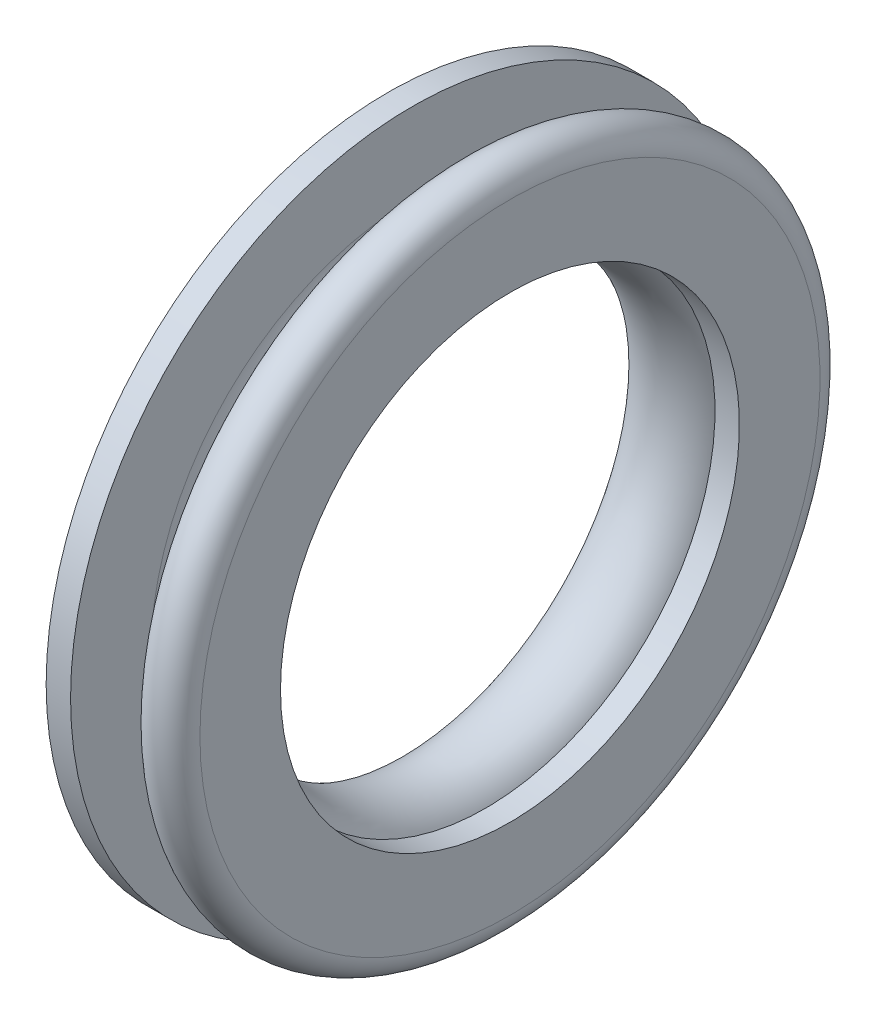
ISO-10303-21;
HEADER;
FILE_DESCRIPTION(('STEP AP214'),'2;1');
FILE_NAME('part.step','',(''),(''),'','','');
FILE_SCHEMA(('AUTOMOTIVE_DESIGN { 1 0 10303 214 1 1 1 1 }'));
ENDSEC;
DATA;
#1=APPLICATION_CONTEXT('core data for automotive mechanical design processes');
#2=APPLICATION_PROTOCOL_DEFINITION('international standard','automotive_design',2000,#1);
#3=PRODUCT_CONTEXT('',#1,'mechanical');
#4=PRODUCT('Part','Part','',(#3));
#5=PRODUCT_RELATED_PRODUCT_CATEGORY('part','',(#4));
#6=PRODUCT_DEFINITION_FORMATION('','',#4);
#7=PRODUCT_DEFINITION_CONTEXT('part definition',#1,'design');
#8=PRODUCT_DEFINITION('design','',#6,#7);
#9=PRODUCT_DEFINITION_SHAPE('','',#8);
#10=(LENGTH_UNIT() NAMED_UNIT(*) SI_UNIT(.MILLI.,.METRE.));
#11=(NAMED_UNIT(*) PLANE_ANGLE_UNIT() SI_UNIT($,.RADIAN.));
#12=(NAMED_UNIT(*) SI_UNIT($,.STERADIAN.) SOLID_ANGLE_UNIT());
#13=UNCERTAINTY_MEASURE_WITH_UNIT(LENGTH_MEASURE(1.E-05),#10,'distance_accuracy_value','');
#14=(GEOMETRIC_REPRESENTATION_CONTEXT(3) GLOBAL_UNCERTAINTY_ASSIGNED_CONTEXT((#13)) GLOBAL_UNIT_ASSIGNED_CONTEXT((#10,
#11,#12)) REPRESENTATION_CONTEXT('',''));
#15=CARTESIAN_POINT('',(0.,0.,0.));
#16=DIRECTION('',(0.,0.,1.));
#17=DIRECTION('',(1.,0.,0.));
#18=AXIS2_PLACEMENT_3D('',#15,#16,#17);
#19=CARTESIAN_POINT('',(1.,-5.35,0.));
#20=DIRECTION('',(-1.,0.,0.));
#21=DIRECTION('',(0.,0.,1.));
#22=AXIS2_PLACEMENT_3D('',#19,#20,#21);
#23=TOROIDAL_SURFACE('',#22,5.35,1.);
#24=CARTESIAN_POINT('',(2.,-5.35,0.));
#25=DIRECTION('',(-1.,0.,0.));
#26=DIRECTION('',(0.,0.,1.));
#27=AXIS2_PLACEMENT_3D('',#24,#25,#26);
#28=CIRCLE('',#27,5.35);
#29=CARTESIAN_POINT('',(2.,-5.35,5.35));
#30=VERTEX_POINT('',#29);
#31=EDGE_CURVE('E10',#30,#30,#28,.T.);
#32=ORIENTED_EDGE('',*,*,#31,.F.);
#33=EDGE_LOOP('',(#32));
#34=FACE_BOUND('',#33,.T.);
#35=CARTESIAN_POINT('',(0.,-5.35,0.));
#36=DIRECTION('',(-1.,0.,0.));
#37=DIRECTION('',(0.,0.,1.));
#38=AXIS2_PLACEMENT_3D('',#35,#36,#37);
#39=CIRCLE('',#38,5.35);
#40=CARTESIAN_POINT('',(0.,-5.35,5.35));
#41=VERTEX_POINT('',#40);
#42=EDGE_CURVE('E67',#41,#41,#39,.T.);
#43=ORIENTED_EDGE('',*,*,#42,.T.);
#44=EDGE_LOOP('',(#43));
#45=FACE_BOUND('',#44,.T.);
#46=ADVANCED_FACE('F33',(#34,#45),#23,.T.);
#47=CARTESIAN_POINT('',(2.,0.,0.));
#48=DIRECTION('',(1.,0.,0.));
#49=DIRECTION('',(0.,0.,-1.));
#50=AXIS2_PLACEMENT_3D('',#47,#48,#49);
#51=PLANE('',#50);
#52=CARTESIAN_POINT('',(2.,-5.35,0.));
#53=DIRECTION('',(-1.,0.,0.));
#54=DIRECTION('',(0.,0.,1.));
#55=AXIS2_PLACEMENT_3D('',#52,#53,#54);
#56=CIRCLE('',#55,4.7);
#57=CARTESIAN_POINT('',(2.,-5.35,4.7));
#58=VERTEX_POINT('',#57);
#59=EDGE_CURVE('E39',#58,#58,#56,.T.);
#60=ORIENTED_EDGE('',*,*,#59,.F.);
#61=EDGE_LOOP('',(#60));
#62=FACE_BOUND('',#61,.T.);
#63=ORIENTED_EDGE('',*,*,#31,.T.);
#64=EDGE_LOOP('',(#63));
#65=FACE_BOUND('',#64,.T.);
#66=ADVANCED_FACE('F96',(#62,#65),#51,.F.);
#67=CARTESIAN_POINT('',(0.,-5.35,0.));
#68=DIRECTION('',(-1.,0.,0.));
#69=DIRECTION('',(0.,0.,1.));
#70=AXIS2_PLACEMENT_3D('',#67,#68,#69);
#71=CYLINDRICAL_SURFACE('',#70,4.7);
#72=ORIENTED_EDGE('',*,*,#59,.T.);
#73=EDGE_LOOP('',(#72));
#74=FACE_BOUND('',#73,.T.);
#75=CARTESIAN_POINT('',(2.5,-5.35,0.));
#76=DIRECTION('',(-1.,0.,0.));
#77=DIRECTION('',(0.,0.,1.));
#78=AXIS2_PLACEMENT_3D('',#75,#76,#77);
#79=CIRCLE('',#78,4.7);
#80=CARTESIAN_POINT('',(2.5,-5.35,4.7));
#81=VERTEX_POINT('',#80);
#82=EDGE_CURVE('E43',#81,#81,#79,.T.);
#83=ORIENTED_EDGE('',*,*,#82,.F.);
#84=EDGE_LOOP('',(#83));
#85=FACE_BOUND('',#84,.T.);
#86=ADVANCED_FACE('F101',(#74,#85),#71,.F.);
#87=CARTESIAN_POINT('',(2.5,0.,0.));
#88=DIRECTION('',(1.,0.,0.));
#89=DIRECTION('',(0.,0.,-1.));
#90=AXIS2_PLACEMENT_3D('',#87,#88,#89);
#91=PLANE('',#90);
#92=ORIENTED_EDGE('',*,*,#82,.T.);
#93=EDGE_LOOP('',(#92));
#94=FACE_BOUND('',#93,.T.);
#95=CARTESIAN_POINT('',(2.5,-5.35,0.));
#96=DIRECTION('',(-1.,0.,0.));
#97=DIRECTION('',(0.,0.,1.));
#98=AXIS2_PLACEMENT_3D('',#95,#96,#97);
#99=CIRCLE('',#98,6.35);
#100=CARTESIAN_POINT('',(2.5,-5.35,6.35));
#101=VERTEX_POINT('',#100);
#102=EDGE_CURVE('E47',#101,#101,#99,.T.);
#103=ORIENTED_EDGE('',*,*,#102,.F.);
#104=EDGE_LOOP('',(#103));
#105=FACE_BOUND('',#104,.T.);
#106=ADVANCED_FACE('F106',(#94,#105),#91,.T.);
#107=CARTESIAN_POINT('',(2.,-5.35,0.));
#108=DIRECTION('',(-1.,0.,0.));
#109=DIRECTION('',(0.,0.,1.));
#110=AXIS2_PLACEMENT_3D('',#107,#108,#109);
#111=TOROIDAL_SURFACE('',#110,6.35,0.5);
#112=ORIENTED_EDGE('',*,*,#102,.T.);
#113=EDGE_LOOP('',(#112));
#114=FACE_BOUND('',#113,.T.);
#115=CARTESIAN_POINT('',(1.5,-5.35,0.));
#116=DIRECTION('',(-1.,0.,0.));
#117=DIRECTION('',(0.,0.,1.));
#118=AXIS2_PLACEMENT_3D('',#115,#116,#117);
#119=CIRCLE('',#118,6.35);
#120=CARTESIAN_POINT('',(1.5,-5.35,6.35));
#121=VERTEX_POINT('',#120);
#122=EDGE_CURVE('E52',#121,#121,#119,.T.);
#123=ORIENTED_EDGE('',*,*,#122,.F.);
#124=EDGE_LOOP('',(#123));
#125=FACE_BOUND('',#124,.T.);
#126=ADVANCED_FACE('F111',(#114,#125),#111,.T.);
#127=CARTESIAN_POINT('',(1.5,0.,0.));
#128=DIRECTION('',(-1.,0.,0.));
#129=DIRECTION('',(0.,0.,1.));
#130=AXIS2_PLACEMENT_3D('',#127,#128,#129);
#131=PLANE('',#130);
#132=ORIENTED_EDGE('',*,*,#122,.T.);
#133=EDGE_LOOP('',(#132));
#134=FACE_BOUND('',#133,.T.);
#135=CARTESIAN_POINT('',(1.5,-5.35,0.));
#136=DIRECTION('',(-1.,0.,0.));
#137=DIRECTION('',(0.,0.,1.));
#138=AXIS2_PLACEMENT_3D('',#135,#136,#137);
#139=CIRCLE('',#138,5.35);
#140=CARTESIAN_POINT('',(1.5,-5.35,5.35));
#141=VERTEX_POINT('',#140);
#142=EDGE_CURVE('E55',#141,#141,#139,.T.);
#143=ORIENTED_EDGE('',*,*,#142,.F.);
#144=EDGE_LOOP('',(#143));
#145=FACE_BOUND('',#144,.T.);
#146=ADVANCED_FACE('F92',(#134,#145),#131,.T.);
#147=CARTESIAN_POINT('',(1.,-5.35,0.));
#148=DIRECTION('',(-1.,0.,0.));
#149=DIRECTION('',(0.,0.,1.));
#150=AXIS2_PLACEMENT_3D('',#147,#148,#149);
#151=TOROIDAL_SURFACE('',#150,5.35,0.5);
#152=ORIENTED_EDGE('',*,*,#142,.T.);
#153=EDGE_LOOP('',(#152));
#154=FACE_BOUND('',#153,.T.);
#155=CARTESIAN_POINT('',(0.5,-5.35,0.));
#156=DIRECTION('',(-1.,0.,0.));
#157=DIRECTION('',(0.,0.,1.));
#158=AXIS2_PLACEMENT_3D('',#155,#156,#157);
#159=CIRCLE('',#158,5.35);
#160=CARTESIAN_POINT('',(0.5,-5.35,5.35));
#161=VERTEX_POINT('',#160);
#162=EDGE_CURVE('E58',#161,#161,#159,.T.);
#163=ORIENTED_EDGE('',*,*,#162,.F.);
#164=EDGE_LOOP('',(#163));
#165=FACE_BOUND('',#164,.T.);
#166=ADVANCED_FACE('F86',(#154,#165),#151,.F.);
#167=CARTESIAN_POINT('',(0.5,0.,0.));
#168=DIRECTION('',(1.,0.,0.));
#169=DIRECTION('',(0.,0.,-1.));
#170=AXIS2_PLACEMENT_3D('',#167,#168,#169);
#171=PLANE('',#170);
#172=ORIENTED_EDGE('',*,*,#162,.T.);
#173=EDGE_LOOP('',(#172));
#174=FACE_BOUND('',#173,.T.);
#175=CARTESIAN_POINT('',(0.5,-5.35,0.));
#176=DIRECTION('',(-1.,0.,0.));
#177=DIRECTION('',(0.,0.,1.));
#178=AXIS2_PLACEMENT_3D('',#175,#176,#177);
#179=CIRCLE('',#178,7.);
#180=CARTESIAN_POINT('',(0.5,-5.35,7.));
#181=VERTEX_POINT('',#180);
#182=EDGE_CURVE('E61',#181,#181,#179,.T.);
#183=ORIENTED_EDGE('',*,*,#182,.F.);
#184=EDGE_LOOP('',(#183));
#185=FACE_BOUND('',#184,.T.);
#186=ADVANCED_FACE('F81',(#174,#185),#171,.T.);
#187=CARTESIAN_POINT('',(0.,-5.35,0.));
#188=DIRECTION('',(-1.,0.,0.));
#189=DIRECTION('',(0.,0.,1.));
#190=AXIS2_PLACEMENT_3D('',#187,#188,#189);
#191=CYLINDRICAL_SURFACE('',#190,7.);
#192=CARTESIAN_POINT('',(0.,-5.35,0.));
#193=DIRECTION('',(-1.,0.,0.));
#194=DIRECTION('',(0.,0.,1.));
#195=AXIS2_PLACEMENT_3D('',#192,#193,#194);
#196=CIRCLE('',#195,7.);
#197=CARTESIAN_POINT('',(0.,-5.35,7.));
#198=VERTEX_POINT('',#197);
#199=EDGE_CURVE('E64',#198,#198,#196,.T.);
#200=ORIENTED_EDGE('',*,*,#199,.F.);
#201=EDGE_LOOP('',(#200));
#202=FACE_BOUND('',#201,.T.);
#203=ORIENTED_EDGE('',*,*,#182,.T.);
#204=EDGE_LOOP('',(#203));
#205=FACE_BOUND('',#204,.T.);
#206=ADVANCED_FACE('F75',(#202,#205),#191,.T.);
#207=CARTESIAN_POINT('',(0.,0.,0.));
#208=DIRECTION('',(1.,0.,0.));
#209=DIRECTION('',(0.,0.,-1.));
#210=AXIS2_PLACEMENT_3D('',#207,#208,#209);
#211=PLANE('',#210);
#212=ORIENTED_EDGE('',*,*,#42,.F.);
#213=EDGE_LOOP('',(#212));
#214=FACE_BOUND('',#213,.T.);
#215=ORIENTED_EDGE('',*,*,#199,.T.);
#216=EDGE_LOOP('',(#215));
#217=FACE_BOUND('',#216,.T.);
#218=ADVANCED_FACE('F72',(#214,#217),#211,.F.);
#219=CLOSED_SHELL('',(#46,#66,#86,#106,#126,#146,#166,#186,#206,#218));
#220=MANIFOLD_SOLID_BREP('B2',#219);
#221=ADVANCED_BREP_SHAPE_REPRESENTATION('',(#18,#220),#14);
#222=SHAPE_DEFINITION_REPRESENTATION(#9,#221);
ENDSEC;
END-ISO-10303-21;
